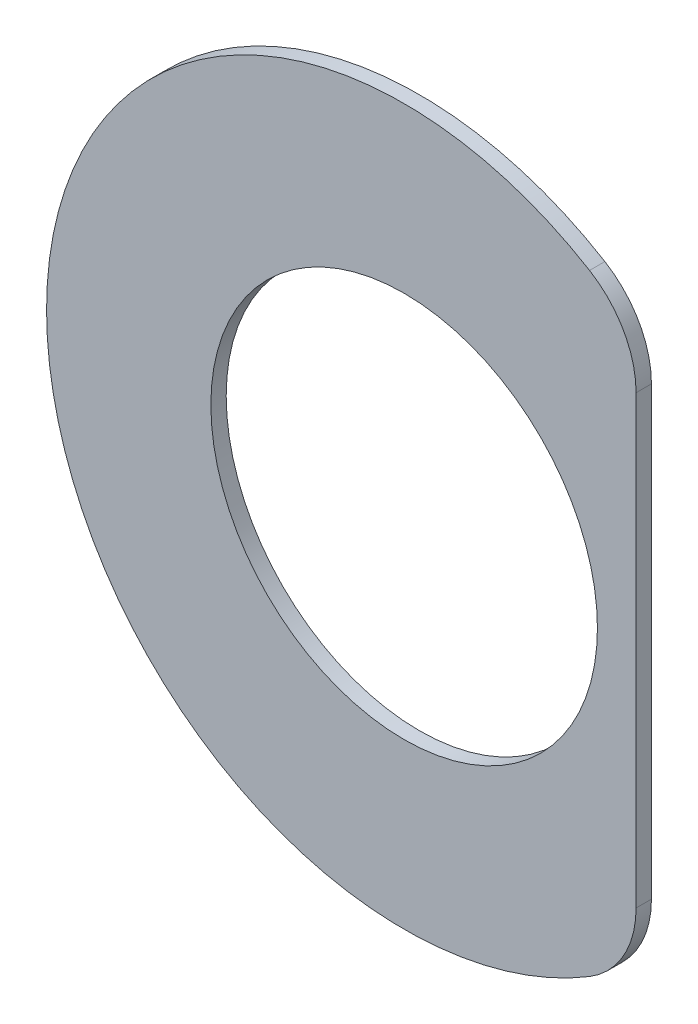
ISO-10303-21;
HEADER;
FILE_DESCRIPTION(('STEP AP214'),'2;1');
FILE_NAME('part.step','',(''),(''),'','','');
FILE_SCHEMA(('AUTOMOTIVE_DESIGN { 1 0 10303 214 1 1 1 1 }'));
ENDSEC;
DATA;
#1=APPLICATION_CONTEXT('core data for automotive mechanical design processes');
#2=APPLICATION_PROTOCOL_DEFINITION('international standard','automotive_design',2000,#1);
#3=PRODUCT_CONTEXT('',#1,'mechanical');
#4=PRODUCT('Part','Part','',(#3));
#5=PRODUCT_RELATED_PRODUCT_CATEGORY('part','',(#4));
#6=PRODUCT_DEFINITION_FORMATION('','',#4);
#7=PRODUCT_DEFINITION_CONTEXT('part definition',#1,'design');
#8=PRODUCT_DEFINITION('design','',#6,#7);
#9=PRODUCT_DEFINITION_SHAPE('','',#8);
#10=(LENGTH_UNIT() NAMED_UNIT(*) SI_UNIT(.MILLI.,.METRE.));
#11=(NAMED_UNIT(*) PLANE_ANGLE_UNIT() SI_UNIT($,.RADIAN.));
#12=(NAMED_UNIT(*) SI_UNIT($,.STERADIAN.) SOLID_ANGLE_UNIT());
#13=UNCERTAINTY_MEASURE_WITH_UNIT(LENGTH_MEASURE(1.E-05),#10,'distance_accuracy_value','');
#14=(GEOMETRIC_REPRESENTATION_CONTEXT(3) GLOBAL_UNCERTAINTY_ASSIGNED_CONTEXT((#13)) GLOBAL_UNIT_ASSIGNED_CONTEXT((#10,
#11,#12)) REPRESENTATION_CONTEXT('',''));
#15=CARTESIAN_POINT('',(0.,0.,0.));
#16=DIRECTION('',(0.,0.,1.));
#17=DIRECTION('',(1.,0.,0.));
#18=AXIS2_PLACEMENT_3D('',#15,#16,#17);
#19=CARTESIAN_POINT('',(0.,0.,0.79375));
#20=DIRECTION('',(0.,0.,-1.));
#21=DIRECTION('',(-1.,0.,0.));
#22=AXIS2_PLACEMENT_3D('',#19,#20,#21);
#23=CYLINDRICAL_SURFACE('',#22,18.5);
#24=CARTESIAN_POINT('',(0.,0.,0.));
#25=DIRECTION('',(0.,0.,1.));
#26=DIRECTION('',(1.,0.,0.));
#27=AXIS2_PLACEMENT_3D('',#24,#25,#26);
#28=CIRCLE('',#27,18.5);
#29=CARTESIAN_POINT('',(9.5925925925926,15.8187283734356,0.));
#30=VERTEX_POINT('',#29);
#31=CARTESIAN_POINT('',(9.5925925925926,-15.8187283734356,0.));
#32=VERTEX_POINT('',#31);
#33=EDGE_CURVE('E81',#30,#32,#28,.T.);
#34=ORIENTED_EDGE('',*,*,#33,.T.);
#35=DIRECTION('',(0.,0.,-1.));
#36=VECTOR('',#35,1.);
#37=CARTESIAN_POINT('',(9.59259259259259,-15.8187283734356,0.79375));
#38=LINE('',#37,#36);
#39=CARTESIAN_POINT('',(9.5925925925926,-15.8187283734356,0.79375));
#40=VERTEX_POINT('',#39);
#41=EDGE_CURVE('E51',#32,#40,#38,.F.);
#42=ORIENTED_EDGE('',*,*,#41,.T.);
#43=CARTESIAN_POINT('',(0.,0.,0.79375));
#44=DIRECTION('',(0.,0.,1.));
#45=DIRECTION('',(1.,0.,0.));
#46=AXIS2_PLACEMENT_3D('',#43,#44,#45);
#47=CIRCLE('',#46,18.5);
#48=CARTESIAN_POINT('',(9.5925925925926,15.8187283734356,0.79375));
#49=VERTEX_POINT('',#48);
#50=EDGE_CURVE('E97',#49,#40,#47,.T.);
#51=ORIENTED_EDGE('',*,*,#50,.F.);
#52=DIRECTION('',(0.,0.,-1.));
#53=VECTOR('',#52,1.);
#54=CARTESIAN_POINT('',(9.59259259259259,15.8187283734356,0.79375));
#55=LINE('',#54,#53);
#56=EDGE_CURVE('E106',#49,#30,#55,.T.);
#57=ORIENTED_EDGE('',*,*,#56,.T.);
#58=EDGE_LOOP('',(#34,#42,#51,#57));
#59=FACE_BOUND('',#58,.T.);
#60=ADVANCED_FACE('F36',(#59),#23,.T.);
#61=CARTESIAN_POINT('',(0.,0.,0.79375));
#62=DIRECTION('',(0.,0.,1.));
#63=DIRECTION('',(1.,0.,0.));
#64=AXIS2_PLACEMENT_3D('',#61,#62,#63);
#65=PLANE('',#64);
#66=CARTESIAN_POINT('',(0.,0.,0.79375));
#67=DIRECTION('',(0.,0.,1.));
#68=DIRECTION('',(1.,0.,0.));
#69=AXIS2_PLACEMENT_3D('',#66,#67,#68);
#70=CIRCLE('',#69,10.);
#71=CARTESIAN_POINT('',(10.,0.,0.79375));
#72=VERTEX_POINT('',#71);
#73=EDGE_CURVE('E100',#72,#72,#70,.T.);
#74=ORIENTED_EDGE('',*,*,#73,.F.);
#75=EDGE_LOOP('',(#74));
#76=FACE_BOUND('',#75,.T.);
#77=ORIENTED_EDGE('',*,*,#50,.T.);
#78=CARTESIAN_POINT('',(7.,-11.5433963806152,0.79375));
#79=DIRECTION('',(0.,0.,1.));
#80=DIRECTION('',(1.,0.,0.));
#81=AXIS2_PLACEMENT_3D('',#78,#79,#80);
#82=CIRCLE('',#81,5.);
#83=CARTESIAN_POINT('',(12.,-11.5433963806152,0.79375));
#84=VERTEX_POINT('',#83);
#85=EDGE_CURVE('E11',#40,#84,#82,.T.);
#86=ORIENTED_EDGE('',*,*,#85,.T.);
#87=DIRECTION('',(0.,-1.,0.));
#88=VECTOR('',#87,1.);
#89=CARTESIAN_POINT('',(12.,0.,0.79375));
#90=LINE('',#89,#88);
#91=CARTESIAN_POINT('',(12.,11.5433963806152,0.79375));
#92=VERTEX_POINT('',#91);
#93=EDGE_CURVE('E95',#92,#84,#90,.T.);
#94=ORIENTED_EDGE('',*,*,#93,.F.);
#95=CARTESIAN_POINT('',(7.,11.5433963806152,0.79375));
#96=DIRECTION('',(0.,0.,1.));
#97=DIRECTION('',(1.,0.,0.));
#98=AXIS2_PLACEMENT_3D('',#95,#96,#97);
#99=CIRCLE('',#98,5.);
#100=EDGE_CURVE('E44',#92,#49,#99,.T.);
#101=ORIENTED_EDGE('',*,*,#100,.T.);
#102=EDGE_LOOP('',(#77,#86,#94,#101));
#103=FACE_BOUND('',#102,.T.);
#104=ADVANCED_FACE('F109',(#76,#103),#65,.T.);
#105=CARTESIAN_POINT('',(0.,0.,0.));
#106=DIRECTION('',(0.,0.,1.));
#107=DIRECTION('',(1.,0.,0.));
#108=AXIS2_PLACEMENT_3D('',#105,#106,#107);
#109=PLANE('',#108);
#110=CARTESIAN_POINT('',(0.,0.,0.));
#111=DIRECTION('',(0.,0.,1.));
#112=DIRECTION('',(1.,0.,0.));
#113=AXIS2_PLACEMENT_3D('',#110,#111,#112);
#114=CIRCLE('',#113,10.);
#115=CARTESIAN_POINT('',(10.,0.,0.));
#116=VERTEX_POINT('',#115);
#117=EDGE_CURVE('E139',#116,#116,#114,.T.);
#118=ORIENTED_EDGE('',*,*,#117,.T.);
#119=EDGE_LOOP('',(#118));
#120=FACE_BOUND('',#119,.T.);
#121=DIRECTION('',(0.,-1.,0.));
#122=VECTOR('',#121,1.);
#123=CARTESIAN_POINT('',(12.,0.,0.));
#124=LINE('',#123,#122);
#125=CARTESIAN_POINT('',(12.,11.5433963806152,0.));
#126=VERTEX_POINT('',#125);
#127=CARTESIAN_POINT('',(12.,-11.5433963806152,0.));
#128=VERTEX_POINT('',#127);
#129=EDGE_CURVE('E80',#126,#128,#124,.T.);
#130=ORIENTED_EDGE('',*,*,#129,.T.);
#131=CARTESIAN_POINT('',(7.,-11.5433963806152,0.));
#132=DIRECTION('',(0.,0.,1.));
#133=DIRECTION('',(1.,0.,0.));
#134=AXIS2_PLACEMENT_3D('',#131,#132,#133);
#135=CIRCLE('',#134,5.);
#136=EDGE_CURVE('E86',#128,#32,#135,.F.);
#137=ORIENTED_EDGE('',*,*,#136,.T.);
#138=ORIENTED_EDGE('',*,*,#33,.F.);
#139=CARTESIAN_POINT('',(7.,11.5433963806152,0.));
#140=DIRECTION('',(0.,0.,1.));
#141=DIRECTION('',(1.,0.,0.));
#142=AXIS2_PLACEMENT_3D('',#139,#140,#141);
#143=CIRCLE('',#142,5.);
#144=EDGE_CURVE('E77',#30,#126,#143,.F.);
#145=ORIENTED_EDGE('',*,*,#144,.T.);
#146=EDGE_LOOP('',(#130,#137,#138,#145));
#147=FACE_BOUND('',#146,.T.);
#148=ADVANCED_FACE('F79',(#120,#147),#109,.F.);
#149=CARTESIAN_POINT('',(0.,0.,0.79375));
#150=DIRECTION('',(0.,0.,-1.));
#151=DIRECTION('',(-1.,0.,0.));
#152=AXIS2_PLACEMENT_3D('',#149,#150,#151);
#153=CYLINDRICAL_SURFACE('',#152,10.);
#154=ORIENTED_EDGE('',*,*,#73,.T.);
#155=EDGE_LOOP('',(#154));
#156=FACE_BOUND('',#155,.T.);
#157=ORIENTED_EDGE('',*,*,#117,.F.);
#158=EDGE_LOOP('',(#157));
#159=FACE_BOUND('',#158,.T.);
#160=ADVANCED_FACE('F117',(#156,#159),#153,.F.);
#161=CARTESIAN_POINT('',(12.,0.,0.79375));
#162=DIRECTION('',(1.,0.,0.));
#163=DIRECTION('',(0.,0.,-1.));
#164=AXIS2_PLACEMENT_3D('',#161,#162,#163);
#165=PLANE('',#164);
#166=ORIENTED_EDGE('',*,*,#93,.T.);
#167=DIRECTION('',(0.,0.,1.));
#168=VECTOR('',#167,1.);
#169=CARTESIAN_POINT('',(12.,-11.5433963806152,0.));
#170=LINE('',#169,#168);
#171=EDGE_CURVE('E87',#84,#128,#170,.F.);
#172=ORIENTED_EDGE('',*,*,#171,.T.);
#173=ORIENTED_EDGE('',*,*,#129,.F.);
#174=DIRECTION('',(0.,0.,1.));
#175=VECTOR('',#174,1.);
#176=CARTESIAN_POINT('',(12.,11.5433963806152,0.79375));
#177=LINE('',#176,#175);
#178=EDGE_CURVE('E93',#126,#92,#177,.T.);
#179=ORIENTED_EDGE('',*,*,#178,.T.);
#180=EDGE_LOOP('',(#166,#172,#173,#179));
#181=FACE_BOUND('',#180,.T.);
#182=ADVANCED_FACE('F92',(#181),#165,.T.);
#183=CARTESIAN_POINT('',(7.,-11.5433963806152,0.79375));
#184=DIRECTION('',(0.,0.,-1.));
#185=DIRECTION('',(-1.,0.,0.));
#186=AXIS2_PLACEMENT_3D('',#183,#184,#185);
#187=CYLINDRICAL_SURFACE('',#186,5.);
#188=ORIENTED_EDGE('',*,*,#85,.F.);
#189=ORIENTED_EDGE('',*,*,#41,.F.);
#190=ORIENTED_EDGE('',*,*,#136,.F.);
#191=ORIENTED_EDGE('',*,*,#171,.F.);
#192=EDGE_LOOP('',(#188,#189,#190,#191));
#193=FACE_BOUND('',#192,.T.);
#194=ADVANCED_FACE('F111',(#193),#187,.T.);
#195=CARTESIAN_POINT('',(7.,11.5433963806152,0.79375));
#196=DIRECTION('',(0.,0.,-1.));
#197=DIRECTION('',(-1.,0.,0.));
#198=AXIS2_PLACEMENT_3D('',#195,#196,#197);
#199=CYLINDRICAL_SURFACE('',#198,5.);
#200=ORIENTED_EDGE('',*,*,#100,.F.);
#201=ORIENTED_EDGE('',*,*,#178,.F.);
#202=ORIENTED_EDGE('',*,*,#144,.F.);
#203=ORIENTED_EDGE('',*,*,#56,.F.);
#204=EDGE_LOOP('',(#200,#201,#202,#203));
#205=FACE_BOUND('',#204,.T.);
#206=ADVANCED_FACE('F38',(#205),#199,.T.);
#207=CLOSED_SHELL('',(#60,#104,#148,#160,#182,#194,#206));
#208=MANIFOLD_SOLID_BREP('B2',#207);
#209=ADVANCED_BREP_SHAPE_REPRESENTATION('',(#18,#208),#14);
#210=SHAPE_DEFINITION_REPRESENTATION(#9,#209);
ENDSEC;
END-ISO-10303-21;
